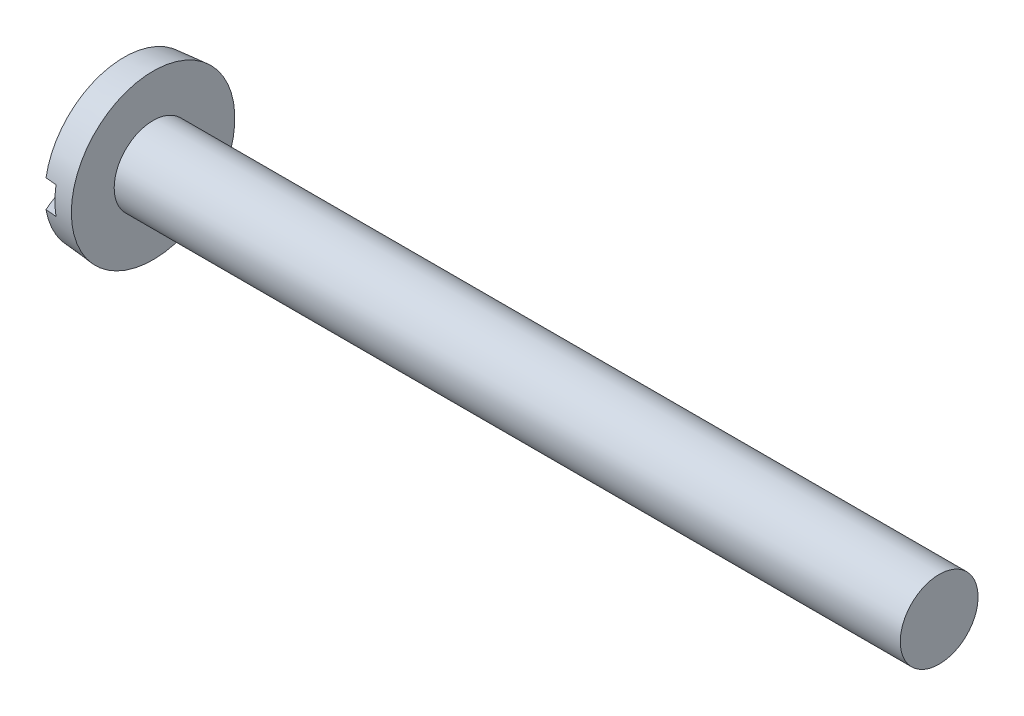
ISO-10303-21;
HEADER;
FILE_DESCRIPTION(('STEP AP214'),'2;1');
FILE_NAME('part.step','',(''),(''),'','','');
FILE_SCHEMA(('AUTOMOTIVE_DESIGN { 1 0 10303 214 1 1 1 1 }'));
ENDSEC;
DATA;
#1=APPLICATION_CONTEXT('core data for automotive mechanical design processes');
#2=APPLICATION_PROTOCOL_DEFINITION('international standard','automotive_design',2000,#1);
#3=PRODUCT_CONTEXT('',#1,'mechanical');
#4=PRODUCT('Part','Part','',(#3));
#5=PRODUCT_RELATED_PRODUCT_CATEGORY('part','',(#4));
#6=PRODUCT_DEFINITION_FORMATION('','',#4);
#7=PRODUCT_DEFINITION_CONTEXT('part definition',#1,'design');
#8=PRODUCT_DEFINITION('design','',#6,#7);
#9=PRODUCT_DEFINITION_SHAPE('','',#8);
#10=(LENGTH_UNIT() NAMED_UNIT(*) SI_UNIT(.MILLI.,.METRE.));
#11=(NAMED_UNIT(*) PLANE_ANGLE_UNIT() SI_UNIT($,.RADIAN.));
#12=(NAMED_UNIT(*) SI_UNIT($,.STERADIAN.) SOLID_ANGLE_UNIT());
#13=UNCERTAINTY_MEASURE_WITH_UNIT(LENGTH_MEASURE(1.E-05),#10,'distance_accuracy_value','');
#14=(GEOMETRIC_REPRESENTATION_CONTEXT(3) GLOBAL_UNCERTAINTY_ASSIGNED_CONTEXT((#13)) GLOBAL_UNIT_ASSIGNED_CONTEXT((#10,
#11,#12)) REPRESENTATION_CONTEXT('',''));
#15=CARTESIAN_POINT('',(0.,0.,0.));
#16=DIRECTION('',(0.,0.,1.));
#17=DIRECTION('',(1.,0.,0.));
#18=AXIS2_PLACEMENT_3D('',#15,#16,#17);
#19=CARTESIAN_POINT('',(6.14054579032417,0.,0.));
#20=DIRECTION('',(-1.,0.,0.));
#21=DIRECTION('',(0.,-1.,0.));
#22=AXIS2_PLACEMENT_3D('',#19,#20,#21);
#23=SPHERICAL_SURFACE('',#22,6.14054579032417);
#24=CARTESIAN_POINT('',(0.558800000000002,0.,0.));
#25=DIRECTION('',(-1.,0.,0.));
#26=DIRECTION('',(0.,0.,1.));
#27=AXIS2_PLACEMENT_3D('',#24,#25,#26);
#28=CIRCLE('',#27,2.55937815401833);
#29=CARTESIAN_POINT('',(0.558800000000002,-0.4445,-2.52048334358041));
#30=VERTEX_POINT('',#29);
#31=CARTESIAN_POINT('',(0.558800000000001,-0.4445,2.52048334358042));
#32=VERTEX_POINT('',#31);
#33=EDGE_CURVE('E106',#30,#32,#28,.T.);
#34=ORIENTED_EDGE('',*,*,#33,.T.);
#35=CARTESIAN_POINT('',(6.14054579032417,-0.4445,0.));
#36=DIRECTION('',(0.,1.,0.));
#37=DIRECTION('',(0.,0.,1.));
#38=AXIS2_PLACEMENT_3D('',#35,#36,#37);
#39=CIRCLE('',#38,6.12443649269611);
#40=EDGE_CURVE('E81',#32,#30,#39,.F.);
#41=ORIENTED_EDGE('',*,*,#40,.T.);
#42=EDGE_LOOP('',(#34,#41));
#43=FACE_BOUND('',#42,.T.);
#44=ADVANCED_FACE('F33',(#43),#23,.T.);
#45=CARTESIAN_POINT('',(0.558800000000001,0.444499999999999,2.52048334358042));
#46=VERTEX_POINT('',#45);
#47=CARTESIAN_POINT('',(0.558800000000002,0.4445,-2.52048334358041));
#48=VERTEX_POINT('',#47);
#49=EDGE_CURVE('E102',#46,#48,#28,.T.);
#50=ORIENTED_EDGE('',*,*,#49,.T.);
#51=CARTESIAN_POINT('',(6.14054579032417,0.4445,0.));
#52=DIRECTION('',(0.,-1.,0.));
#53=DIRECTION('',(0.,0.,-1.));
#54=AXIS2_PLACEMENT_3D('',#51,#52,#53);
#55=CIRCLE('',#54,6.12443649269611);
#56=EDGE_CURVE('E116',#48,#46,#55,.F.);
#57=ORIENTED_EDGE('',*,*,#56,.T.);
#58=EDGE_LOOP('',(#50,#57));
#59=FACE_BOUND('',#58,.T.);
#60=ADVANCED_FACE('F122',(#59),#23,.T.);
#61=CARTESIAN_POINT('',(1.4986,0.,0.));
#62=DIRECTION('',(1.,0.,0.));
#63=DIRECTION('',(0.,0.,-1.));
#64=AXIS2_PLACEMENT_3D('',#61,#62,#63);
#65=CONICAL_SURFACE('',#64,2.6416,0.0872664625997192);
#66=CARTESIAN_POINT('',(1.4986,0.,0.));
#67=DIRECTION('',(-1.,0.,0.));
#68=DIRECTION('',(0.,0.,1.));
#69=AXIS2_PLACEMENT_3D('',#66,#67,#68);
#70=CIRCLE('',#69,2.6416);
#71=CARTESIAN_POINT('',(1.4986,0.,2.6416));
#72=VERTEX_POINT('',#71);
#73=EDGE_CURVE('E109',#72,#72,#70,.T.);
#74=ORIENTED_EDGE('',*,*,#73,.T.);
#75=EDGE_LOOP('',(#74));
#76=FACE_BOUND('',#75,.T.);
#77=CARTESIAN_POINT('',(-4.02316770320585,-0.4445,2.11224435261335));
#78=CARTESIAN_POINT('',(-2.70478241528809,-0.4445,2.23009745858034));
#79=CARTESIAN_POINT('',(-1.38636378012758,-0.4445,2.34757641088397));
#80=CARTESIAN_POINT('',(0.183798850530649,-0.4445,2.48716541142451));
#81=CARTESIAN_POINT('',(0.43551987087665,-0.4445,2.5095338068244));
#82=CARTESIAN_POINT('',(2.25741472189879,-0.4445,2.6713648402123));
#83=CARTESIAN_POINT('',(3.82761899459398,-0.4445,2.81048495149449));
#84=CARTESIAN_POINT('',(5.39783846111182,-0.4445,2.94943259914973));
#85=B_SPLINE_CURVE_WITH_KNOTS('',3,(#77,#78,#79,#80,#81,#82,#83,#84),.UNSPECIFIED.,.F.,.F.,(4,2,
2,4),(0.,3.97092691876799,4.729065661957,9.4581312226766),.UNSPECIFIED.);
#86=CARTESIAN_POINT('',(0.9144,-0.4445,2.55206850323029));
#87=VERTEX_POINT('',#86);
#88=EDGE_CURVE('E11',#32,#87,#85,.T.);
#89=ORIENTED_EDGE('',*,*,#88,.F.);
#90=ORIENTED_EDGE('',*,*,#33,.F.);
#91=CARTESIAN_POINT('',(5.39783846111182,-0.4445,-2.94943259914973));
#92=CARTESIAN_POINT('',(4.61272794664961,-0.4445,-2.8799672668081));
#93=CARTESIAN_POINT('',(3.82762196755725,-0.4445,-2.81045062183259));
#94=CARTESIAN_POINT('',(2.25742206388613,-0.4445,-2.67128178581139));
#95=CARTESIAN_POINT('',(1.47232813930676,-0.4445,-2.60162959477254));
#96=CARTESIAN_POINT('',(-0.0978447686725528,-0.4445,-2.46215673723073));
#97=CARTESIAN_POINT('',(-0.882923752072153,-0.4445,-2.39233607072394));
#98=CARTESIAN_POINT('',(-2.45306186336723,-0.4445,-2.25247141457342));
#99=CARTESIAN_POINT('',(-3.23812099126169,-0.4445,-2.18242742491831));
#100=CARTESIAN_POINT('',(-4.02316770320585,-0.4445,-2.11224435261335));
#101=B_SPLINE_CURVE_WITH_KNOTS('',3,(#91,#92,#93,#94,#95,#96,#97,#98,#99,#100),.UNSPECIFIED.,
.F.,.F.,(4,2,2,2,4),(0.,2.36453284884076,4.72906557834068,7.09359836162099,9.45813126526527),.UNSPECIFIED.);
#102=CARTESIAN_POINT('',(0.9144,-0.4445,-2.55206850323029));
#103=VERTEX_POINT('',#102);
#104=EDGE_CURVE('E62',#103,#30,#101,.T.);
#105=ORIENTED_EDGE('',*,*,#104,.F.);
#106=CARTESIAN_POINT('',(0.9144,0.,0.));
#107=DIRECTION('',(1.,0.,0.));
#108=DIRECTION('',(0.,0.,-1.));
#109=AXIS2_PLACEMENT_3D('',#106,#107,#108);
#110=CIRCLE('',#109,2.59048912276815);
#111=CARTESIAN_POINT('',(0.9144,0.4445,-2.55206850323029));
#112=VERTEX_POINT('',#111);
#113=EDGE_CURVE('E89',#103,#112,#110,.T.);
#114=ORIENTED_EDGE('',*,*,#113,.T.);
#115=CARTESIAN_POINT('',(-4.02316770320585,0.4445,-2.11224435261335));
#116=CARTESIAN_POINT('',(-2.70478241528809,0.4445,-2.23009745858034));
#117=CARTESIAN_POINT('',(-1.38636378012758,0.4445,-2.34757641088397));
#118=CARTESIAN_POINT('',(0.183798850530649,0.4445,-2.48716541142451));
#119=CARTESIAN_POINT('',(0.43551987087665,0.4445,-2.5095338068244));
#120=CARTESIAN_POINT('',(2.25741472189879,0.4445,-2.6713648402123));
#121=CARTESIAN_POINT('',(3.82761899459398,0.4445,-2.81048495149449));
#122=CARTESIAN_POINT('',(5.39783846111182,0.4445,-2.94943259914973));
#123=B_SPLINE_CURVE_WITH_KNOTS('',3,(#115,#116,#117,#118,#119,#120,#121,#122),.UNSPECIFIED.,.F.,
.F.,(4,2,2,4),(0.,3.97092691876799,4.729065661957,9.4581312226766),.UNSPECIFIED.);
#124=EDGE_CURVE('E95',#48,#112,#123,.T.);
#125=ORIENTED_EDGE('',*,*,#124,.F.);
#126=ORIENTED_EDGE('',*,*,#49,.F.);
#127=CARTESIAN_POINT('',(5.39783846111182,0.444499999999999,2.94943259914973));
#128=CARTESIAN_POINT('',(4.61272794664961,0.444499999999999,2.8799672668081));
#129=CARTESIAN_POINT('',(3.82762196755725,0.444499999999999,2.81045062183259));
#130=CARTESIAN_POINT('',(2.25742206388613,0.444499999999999,2.67128178581139));
#131=CARTESIAN_POINT('',(1.47232813930676,0.444499999999999,2.60162959477254));
#132=CARTESIAN_POINT('',(-0.0978447686725531,0.444499999999999,2.46215673723073));
#133=CARTESIAN_POINT('',(-0.882923752072153,0.444499999999999,2.39233607072394));
#134=CARTESIAN_POINT('',(-2.45306186336723,0.444499999999999,2.25247141457342));
#135=CARTESIAN_POINT('',(-3.23812099126169,0.444499999999999,2.18242742491831));
#136=CARTESIAN_POINT('',(-4.02316770320585,0.444499999999999,2.11224435261335));
#137=B_SPLINE_CURVE_WITH_KNOTS('',3,(#127,#128,#129,#130,#131,#132,#133,#134,#135,#136),
.UNSPECIFIED.,.F.,.F.,(4,2,2,2,4),(0.,2.36453284884076,4.72906557834067,7.09359836162099,
9.45813126526527),.UNSPECIFIED.);
#138=CARTESIAN_POINT('',(0.9144,0.444499999999999,2.55206850323029));
#139=VERTEX_POINT('',#138);
#140=EDGE_CURVE('E47',#139,#46,#137,.T.);
#141=ORIENTED_EDGE('',*,*,#140,.F.);
#142=EDGE_CURVE('E87',#139,#87,#110,.T.);
#143=ORIENTED_EDGE('',*,*,#142,.T.);
#144=EDGE_LOOP('',(#89,#90,#105,#114,#125,#126,#141,#143));
#145=FACE_BOUND('',#144,.T.);
#146=ADVANCED_FACE('F92',(#76,#145),#65,.T.);
#147=CARTESIAN_POINT('',(-25.4,0.,0.));
#148=DIRECTION('',(-1.,0.,0.));
#149=DIRECTION('',(0.,0.,1.));
#150=AXIS2_PLACEMENT_3D('',#147,#148,#149);
#151=CYLINDRICAL_SURFACE('',#150,1.2573);
#152=CARTESIAN_POINT('',(26.8986,0.,0.));
#153=DIRECTION('',(-1.,0.,0.));
#154=DIRECTION('',(0.,0.,1.));
#155=AXIS2_PLACEMENT_3D('',#152,#153,#154);
#156=CIRCLE('',#155,1.2573);
#157=CARTESIAN_POINT('',(26.8986,0.,1.2573));
#158=VERTEX_POINT('',#157);
#159=EDGE_CURVE('E99',#158,#158,#156,.T.);
#160=ORIENTED_EDGE('',*,*,#159,.T.);
#161=EDGE_LOOP('',(#160));
#162=FACE_BOUND('',#161,.T.);
#163=CARTESIAN_POINT('',(1.4986,0.,0.));
#164=DIRECTION('',(-1.,0.,0.));
#165=DIRECTION('',(0.,0.,1.));
#166=AXIS2_PLACEMENT_3D('',#163,#164,#165);
#167=CIRCLE('',#166,1.2573);
#168=CARTESIAN_POINT('',(1.4986,0.,1.2573));
#169=VERTEX_POINT('',#168);
#170=EDGE_CURVE('E112',#169,#169,#167,.T.);
#171=ORIENTED_EDGE('',*,*,#170,.F.);
#172=EDGE_LOOP('',(#171));
#173=FACE_BOUND('',#172,.T.);
#174=ADVANCED_FACE('F35',(#162,#173),#151,.T.);
#175=CARTESIAN_POINT('',(26.8986,1.2573,0.));
#176=DIRECTION('',(1.,0.,0.));
#177=DIRECTION('',(0.,0.,-1.));
#178=AXIS2_PLACEMENT_3D('',#175,#176,#177);
#179=PLANE('',#178);
#180=ORIENTED_EDGE('',*,*,#159,.F.);
#181=EDGE_LOOP('',(#180));
#182=FACE_BOUND('',#181,.T.);
#183=ADVANCED_FACE('F133',(#182),#179,.T.);
#184=CARTESIAN_POINT('',(1.4986,1.2573,0.));
#185=DIRECTION('',(-1.,0.,0.));
#186=DIRECTION('',(0.,0.,1.));
#187=AXIS2_PLACEMENT_3D('',#184,#185,#186);
#188=PLANE('',#187);
#189=ORIENTED_EDGE('',*,*,#73,.F.);
#190=EDGE_LOOP('',(#189));
#191=FACE_BOUND('',#190,.T.);
#192=ORIENTED_EDGE('',*,*,#170,.T.);
#193=EDGE_LOOP('',(#192));
#194=FACE_BOUND('',#193,.T.);
#195=ADVANCED_FACE('F135',(#191,#194),#188,.F.);
#196=CARTESIAN_POINT('',(0.9144,-0.4445,2.6416));
#197=DIRECTION('',(0.,1.,0.));
#198=DIRECTION('',(0.,0.,1.));
#199=AXIS2_PLACEMENT_3D('',#196,#197,#198);
#200=PLANE('',#199);
#201=ORIENTED_EDGE('',*,*,#104,.T.);
#202=ORIENTED_EDGE('',*,*,#40,.F.);
#203=ORIENTED_EDGE('',*,*,#88,.T.);
#204=DIRECTION('',(0.,0.,-1.));
#205=VECTOR('',#204,1.);
#206=CARTESIAN_POINT('',(0.9144,-0.4445,2.6416));
#207=LINE('',#206,#205);
#208=EDGE_CURVE('E80',#87,#103,#207,.T.);
#209=ORIENTED_EDGE('',*,*,#208,.T.);
#210=EDGE_LOOP('',(#201,#202,#203,#209));
#211=FACE_BOUND('',#210,.T.);
#212=ADVANCED_FACE('F79',(#211),#200,.T.);
#213=CARTESIAN_POINT('',(0.9144,0.4445,-2.6416));
#214=DIRECTION('',(0.,-1.,0.));
#215=DIRECTION('',(0.,0.,-1.));
#216=AXIS2_PLACEMENT_3D('',#213,#214,#215);
#217=PLANE('',#216);
#218=ORIENTED_EDGE('',*,*,#124,.T.);
#219=DIRECTION('',(0.,0.,1.));
#220=VECTOR('',#219,1.);
#221=CARTESIAN_POINT('',(0.9144,0.4445,-2.6416));
#222=LINE('',#221,#220);
#223=EDGE_CURVE('E54',#112,#139,#222,.T.);
#224=ORIENTED_EDGE('',*,*,#223,.T.);
#225=ORIENTED_EDGE('',*,*,#140,.T.);
#226=ORIENTED_EDGE('',*,*,#56,.F.);
#227=EDGE_LOOP('',(#218,#224,#225,#226));
#228=FACE_BOUND('',#227,.T.);
#229=ADVANCED_FACE('F120',(#228),#217,.T.);
#230=CARTESIAN_POINT('',(0.9144,-0.4445,-2.6416));
#231=DIRECTION('',(1.,0.,0.));
#232=DIRECTION('',(0.,0.,-1.));
#233=AXIS2_PLACEMENT_3D('',#230,#231,#232);
#234=PLANE('',#233);
#235=ORIENTED_EDGE('',*,*,#223,.F.);
#236=ORIENTED_EDGE('',*,*,#113,.F.);
#237=ORIENTED_EDGE('',*,*,#208,.F.);
#238=ORIENTED_EDGE('',*,*,#142,.F.);
#239=EDGE_LOOP('',(#235,#236,#237,#238));
#240=FACE_BOUND('',#239,.T.);
#241=ADVANCED_FACE('F86',(#240),#234,.F.);
#242=CLOSED_SHELL('',(#44,#60,#146,#174,#183,#195,#212,#229,#241));
#243=MANIFOLD_SOLID_BREP('B2',#242);
#244=ADVANCED_BREP_SHAPE_REPRESENTATION('',(#18,#243),#14);
#245=SHAPE_DEFINITION_REPRESENTATION(#9,#244);
ENDSEC;
END-ISO-10303-21;
